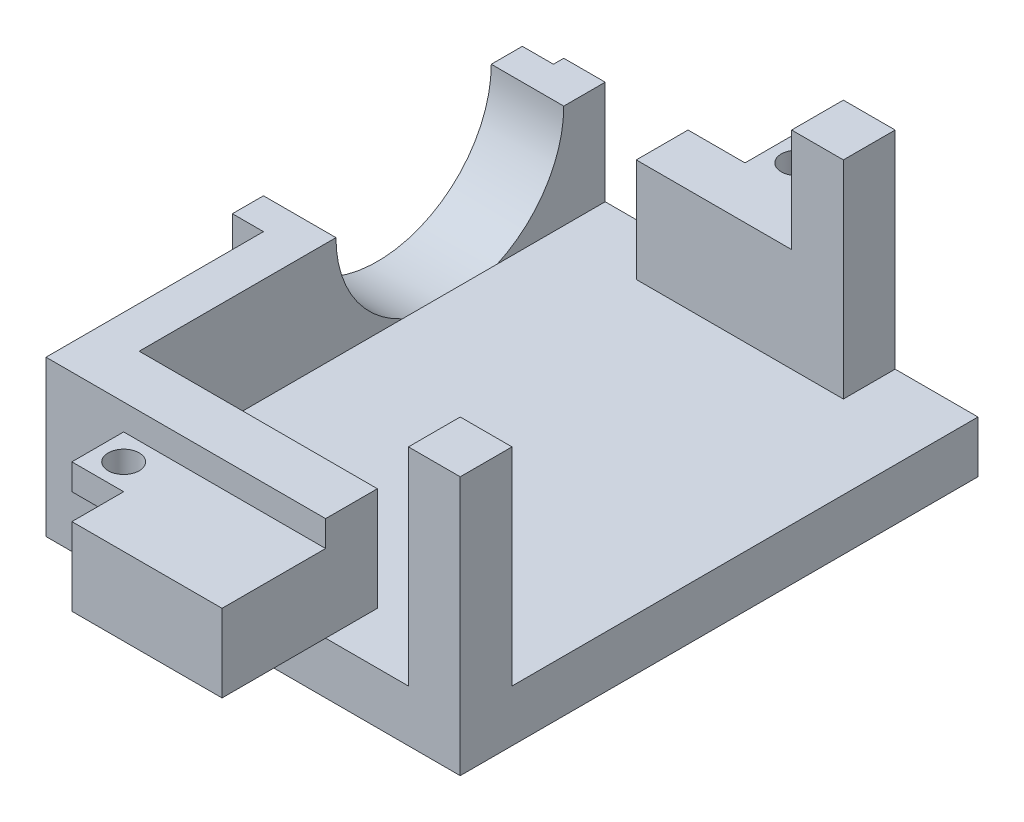
ISO-10303-21;
HEADER;
FILE_DESCRIPTION(('STEP AP214'),'2;1');
FILE_NAME('part.step','',(''),(''),'','','');
FILE_SCHEMA(('AUTOMOTIVE_DESIGN { 1 0 10303 214 1 1 1 1 }'));
ENDSEC;
DATA;
#1=APPLICATION_CONTEXT('core data for automotive mechanical design processes');
#2=APPLICATION_PROTOCOL_DEFINITION('international standard','automotive_design',2000,#1);
#3=PRODUCT_CONTEXT('',#1,'mechanical');
#4=PRODUCT('Part','Part','',(#3));
#5=PRODUCT_RELATED_PRODUCT_CATEGORY('part','',(#4));
#6=PRODUCT_DEFINITION_FORMATION('','',#4);
#7=PRODUCT_DEFINITION_CONTEXT('part definition',#1,'design');
#8=PRODUCT_DEFINITION('design','',#6,#7);
#9=PRODUCT_DEFINITION_SHAPE('','',#8);
#10=(LENGTH_UNIT() NAMED_UNIT(*) SI_UNIT(.MILLI.,.METRE.));
#11=(NAMED_UNIT(*) PLANE_ANGLE_UNIT() SI_UNIT($,.RADIAN.));
#12=(NAMED_UNIT(*) SI_UNIT($,.STERADIAN.) SOLID_ANGLE_UNIT());
#13=UNCERTAINTY_MEASURE_WITH_UNIT(LENGTH_MEASURE(1.E-05),#10,'distance_accuracy_value','');
#14=(GEOMETRIC_REPRESENTATION_CONTEXT(3) GLOBAL_UNCERTAINTY_ASSIGNED_CONTEXT((#13)) GLOBAL_UNIT_ASSIGNED_CONTEXT((#10,
#11,#12)) REPRESENTATION_CONTEXT('',''));
#15=CARTESIAN_POINT('',(0.,0.,0.));
#16=DIRECTION('',(0.,0.,1.));
#17=DIRECTION('',(1.,0.,0.));
#18=AXIS2_PLACEMENT_3D('',#15,#16,#17);
#19=CARTESIAN_POINT('',(-20.,5.,-25.));
#20=DIRECTION('',(0.,0.,1.));
#21=DIRECTION('',(1.,0.,0.));
#22=AXIS2_PLACEMENT_3D('',#19,#20,#21);
#23=PLANE('',#22);
#24=DIRECTION('',(0.,-1.,0.));
#25=VECTOR('',#24,1.);
#26=CARTESIAN_POINT('',(2.5,15.,-25.));
#27=LINE('',#26,#25);
#28=CARTESIAN_POINT('',(2.5,15.,-25.));
#29=VERTEX_POINT('',#28);
#30=CARTESIAN_POINT('',(2.5,10.,-25.));
#31=VERTEX_POINT('',#30);
#32=EDGE_CURVE('E359',#29,#31,#27,.T.);
#33=ORIENTED_EDGE('',*,*,#32,.F.);
#34=DIRECTION('',(-1.,0.,0.));
#35=VECTOR('',#34,1.);
#36=CARTESIAN_POINT('',(0.,15.,-25.));
#37=LINE('',#36,#35);
#38=CARTESIAN_POINT('',(7.,15.,-25.));
#39=VERTEX_POINT('',#38);
#40=EDGE_CURVE('E478',#39,#29,#37,.T.);
#41=ORIENTED_EDGE('',*,*,#40,.F.);
#42=DIRECTION('',(0.,-1.,0.));
#43=VECTOR('',#42,1.);
#44=CARTESIAN_POINT('',(7.,25.,-25.));
#45=LINE('',#44,#43);
#46=CARTESIAN_POINT('',(7.,25.,-25.));
#47=VERTEX_POINT('',#46);
#48=EDGE_CURVE('E510',#47,#39,#45,.T.);
#49=ORIENTED_EDGE('',*,*,#48,.F.);
#50=DIRECTION('',(-1.,0.,0.));
#51=VECTOR('',#50,1.);
#52=CARTESIAN_POINT('',(0.,25.,-25.));
#53=LINE('',#52,#51);
#54=CARTESIAN_POINT('',(12.,25.,-25.));
#55=VERTEX_POINT('',#54);
#56=EDGE_CURVE('E499',#55,#47,#53,.T.);
#57=ORIENTED_EDGE('',*,*,#56,.F.);
#58=DIRECTION('',(0.,-1.,0.));
#59=VECTOR('',#58,1.);
#60=CARTESIAN_POINT('',(12.,25.,-25.));
#61=LINE('',#60,#59);
#62=CARTESIAN_POINT('',(12.,5.,-25.));
#63=VERTEX_POINT('',#62);
#64=EDGE_CURVE('E513',#55,#63,#61,.T.);
#65=ORIENTED_EDGE('',*,*,#64,.T.);
#66=DIRECTION('',(-1.,0.,0.));
#67=VECTOR('',#66,1.);
#68=CARTESIAN_POINT('',(-20.,5.,-25.));
#69=LINE('',#68,#67);
#70=CARTESIAN_POINT('',(20.,5.,-25.));
#71=VERTEX_POINT('',#70);
#72=EDGE_CURVE('E550',#71,#63,#69,.T.);
#73=ORIENTED_EDGE('',*,*,#72,.F.);
#74=DIRECTION('',(0.,-1.,0.));
#75=VECTOR('',#74,1.);
#76=CARTESIAN_POINT('',(20.,5.,-25.));
#77=LINE('',#76,#75);
#78=CARTESIAN_POINT('',(20.,0.,-25.));
#79=VERTEX_POINT('',#78);
#80=EDGE_CURVE('E562',#71,#79,#77,.T.);
#81=ORIENTED_EDGE('',*,*,#80,.T.);
#82=DIRECTION('',(-1.,0.,0.));
#83=VECTOR('',#82,1.);
#84=CARTESIAN_POINT('',(-20.,0.,-25.));
#85=LINE('',#84,#83);
#86=CARTESIAN_POINT('',(-20.,0.,-25.));
#87=VERTEX_POINT('',#86);
#88=EDGE_CURVE('E547',#79,#87,#85,.T.);
#89=ORIENTED_EDGE('',*,*,#88,.T.);
#90=DIRECTION('',(0.,-1.,0.));
#91=VECTOR('',#90,1.);
#92=CARTESIAN_POINT('',(-20.,5.,-25.));
#93=LINE('',#92,#91);
#94=CARTESIAN_POINT('',(-20.,15.,-25.));
#95=VERTEX_POINT('',#94);
#96=EDGE_CURVE('E552',#95,#87,#93,.T.);
#97=ORIENTED_EDGE('',*,*,#96,.F.);
#98=DIRECTION('',(-1.,0.,0.));
#99=VECTOR('',#98,1.);
#100=CARTESIAN_POINT('',(0.,15.,-25.));
#101=LINE('',#100,#99);
#102=CARTESIAN_POINT('',(-16.,15.,-25.));
#103=VERTEX_POINT('',#102);
#104=EDGE_CURVE('E444',#103,#95,#101,.T.);
#105=ORIENTED_EDGE('',*,*,#104,.F.);
#106=DIRECTION('',(0.,-1.,0.));
#107=VECTOR('',#106,1.);
#108=CARTESIAN_POINT('',(-16.,15.,-25.));
#109=LINE('',#108,#107);
#110=CARTESIAN_POINT('',(-16.,5.,-25.));
#111=VERTEX_POINT('',#110);
#112=EDGE_CURVE('E464',#103,#111,#109,.T.);
#113=ORIENTED_EDGE('',*,*,#112,.T.);
#114=CARTESIAN_POINT('',(-8.,5.,-25.));
#115=VERTEX_POINT('',#114);
#116=EDGE_CURVE('E549',#115,#111,#69,.T.);
#117=ORIENTED_EDGE('',*,*,#116,.F.);
#118=DIRECTION('',(0.,-1.,0.));
#119=VECTOR('',#118,1.);
#120=CARTESIAN_POINT('',(-8.,15.,-25.));
#121=LINE('',#120,#119);
#122=CARTESIAN_POINT('',(-8.,15.,-25.));
#123=VERTEX_POINT('',#122);
#124=EDGE_CURVE('E490',#123,#115,#121,.T.);
#125=ORIENTED_EDGE('',*,*,#124,.F.);
#126=CARTESIAN_POINT('',(-2.5,15.,-25.));
#127=VERTEX_POINT('',#126);
#128=EDGE_CURVE('E477',#127,#123,#37,.T.);
#129=ORIENTED_EDGE('',*,*,#128,.F.);
#130=DIRECTION('',(0.,1.,0.));
#131=VECTOR('',#130,1.);
#132=CARTESIAN_POINT('',(-2.5,15.,-25.));
#133=LINE('',#132,#131);
#134=CARTESIAN_POINT('',(-2.5,10.,-25.));
#135=VERTEX_POINT('',#134);
#136=EDGE_CURVE('E366',#135,#127,#133,.T.);
#137=ORIENTED_EDGE('',*,*,#136,.F.);
#138=DIRECTION('',(-1.,0.,0.));
#139=VECTOR('',#138,1.);
#140=CARTESIAN_POINT('',(2.5,10.,-25.));
#141=LINE('',#140,#139);
#142=EDGE_CURVE('E92',#31,#135,#141,.T.);
#143=ORIENTED_EDGE('',*,*,#142,.F.);
#144=EDGE_LOOP('',(#33,#41,#49,#57,#65,#73,#81,#89,#97,#105,#113,#117,#125,#129,#137,#143));
#145=FACE_BOUND('',#144,.T.);
#146=ADVANCED_FACE('F69',(#145),#23,.F.);
#147=CARTESIAN_POINT('',(-20.,5.,-25.));
#148=DIRECTION('',(1.,0.,0.));
#149=DIRECTION('',(0.,0.,-1.));
#150=AXIS2_PLACEMENT_3D('',#147,#148,#149);
#151=PLANE('',#150);
#152=DIRECTION('',(0.,1.,0.));
#153=VECTOR('',#152,1.);
#154=CARTESIAN_POINT('',(-20.,15.,4.00000000000001));
#155=LINE('',#154,#153);
#156=CARTESIAN_POINT('',(-20.,0.,4.00000000000001));
#157=VERTEX_POINT('',#156);
#158=CARTESIAN_POINT('',(-20.,15.,4.00000000000001));
#159=VERTEX_POINT('',#158);
#160=EDGE_CURVE('E393',#157,#159,#155,.T.);
#161=ORIENTED_EDGE('',*,*,#160,.F.);
#162=DIRECTION('',(0.,0.,1.));
#163=VECTOR('',#162,1.);
#164=CARTESIAN_POINT('',(-20.,0.,-25.));
#165=LINE('',#164,#163);
#166=CARTESIAN_POINT('',(-20.,0.,25.));
#167=VERTEX_POINT('',#166);
#168=EDGE_CURVE('E543',#157,#167,#165,.T.);
#169=ORIENTED_EDGE('',*,*,#168,.T.);
#170=DIRECTION('',(0.,-1.,0.));
#171=VECTOR('',#170,1.);
#172=CARTESIAN_POINT('',(-20.,5.,25.));
#173=LINE('',#172,#171);
#174=CARTESIAN_POINT('',(-20.,15.,25.));
#175=VERTEX_POINT('',#174);
#176=EDGE_CURVE('E12',#175,#167,#173,.T.);
#177=ORIENTED_EDGE('',*,*,#176,.F.);
#178=DIRECTION('',(0.,0.,1.));
#179=VECTOR('',#178,1.);
#180=CARTESIAN_POINT('',(-20.,15.,0.));
#181=LINE('',#180,#179);
#182=EDGE_CURVE('E447',#159,#175,#181,.T.);
#183=ORIENTED_EDGE('',*,*,#182,.F.);
#184=EDGE_LOOP('',(#161,#169,#177,#183));
#185=FACE_BOUND('',#184,.T.);
#186=ADVANCED_FACE('F71',(#185),#151,.F.);
#187=DIRECTION('',(0.,-1.,0.));
#188=VECTOR('',#187,1.);
#189=CARTESIAN_POINT('',(-20.,0.,-24.));
#190=LINE('',#189,#188);
#191=CARTESIAN_POINT('',(-20.,15.,-24.));
#192=VERTEX_POINT('',#191);
#193=CARTESIAN_POINT('',(-20.,0.,-24.));
#194=VERTEX_POINT('',#193);
#195=EDGE_CURVE('E388',#192,#194,#190,.T.);
#196=ORIENTED_EDGE('',*,*,#195,.F.);
#197=EDGE_CURVE('E448',#95,#192,#181,.T.);
#198=ORIENTED_EDGE('',*,*,#197,.F.);
#199=ORIENTED_EDGE('',*,*,#96,.T.);
#200=EDGE_CURVE('E553',#87,#194,#165,.T.);
#201=ORIENTED_EDGE('',*,*,#200,.T.);
#202=EDGE_LOOP('',(#196,#198,#199,#201));
#203=FACE_BOUND('',#202,.T.);
#204=ADVANCED_FACE('F583',(#203),#151,.F.);
#205=CARTESIAN_POINT('',(-16.,15.,0.));
#206=DIRECTION('',(1.,0.,0.));
#207=DIRECTION('',(0.,0.,-1.));
#208=AXIS2_PLACEMENT_3D('',#205,#206,#207);
#209=PLANE('',#208);
#210=CARTESIAN_POINT('',(-16.,15.,-9.99999999999999));
#211=DIRECTION('',(-1.,0.,0.));
#212=DIRECTION('',(0.,0.,1.));
#213=AXIS2_PLACEMENT_3D('',#210,#211,#212);
#214=CIRCLE('',#213,11.);
#215=CARTESIAN_POINT('',(-16.,5.,-5.41742430504415));
#216=VERTEX_POINT('',#215);
#217=CARTESIAN_POINT('',(-16.,15.,1.00000000000001));
#218=VERTEX_POINT('',#217);
#219=EDGE_CURVE('E420',#216,#218,#214,.T.);
#220=ORIENTED_EDGE('',*,*,#219,.T.);
#221=DIRECTION('',(0.,0.,1.));
#222=VECTOR('',#221,1.);
#223=CARTESIAN_POINT('',(-16.,15.,0.));
#224=LINE('',#223,#222);
#225=CARTESIAN_POINT('',(-16.,15.,20.));
#226=VERTEX_POINT('',#225);
#227=EDGE_CURVE('E440',#218,#226,#224,.T.);
#228=ORIENTED_EDGE('',*,*,#227,.T.);
#229=DIRECTION('',(0.,-1.,0.));
#230=VECTOR('',#229,1.);
#231=CARTESIAN_POINT('',(-16.,15.,20.));
#232=LINE('',#231,#230);
#233=CARTESIAN_POINT('',(-16.,5.,20.));
#234=VERTEX_POINT('',#233);
#235=EDGE_CURVE('E467',#226,#234,#232,.T.);
#236=ORIENTED_EDGE('',*,*,#235,.T.);
#237=DIRECTION('',(0.,0.,1.));
#238=VECTOR('',#237,1.);
#239=CARTESIAN_POINT('',(-16.,5.,0.));
#240=LINE('',#239,#238);
#241=EDGE_CURVE('E459',#216,#234,#240,.T.);
#242=ORIENTED_EDGE('',*,*,#241,.F.);
#243=EDGE_LOOP('',(#220,#228,#236,#242));
#244=FACE_BOUND('',#243,.T.);
#245=ADVANCED_FACE('F899',(#244),#209,.T.);
#246=CARTESIAN_POINT('',(0.,15.,0.));
#247=DIRECTION('',(0.,1.,0.));
#248=DIRECTION('',(0.,0.,1.));
#249=AXIS2_PLACEMENT_3D('',#246,#247,#248);
#250=PLANE('',#249);
#251=DIRECTION('',(-1.,0.,0.));
#252=VECTOR('',#251,1.);
#253=CARTESIAN_POINT('',(-16.,15.,-21.));
#254=LINE('',#253,#252);
#255=CARTESIAN_POINT('',(-16.,15.,-21.));
#256=VERTEX_POINT('',#255);
#257=CARTESIAN_POINT('',(-23.,15.,-21.));
#258=VERTEX_POINT('',#257);
#259=EDGE_CURVE('E426',#256,#258,#254,.T.);
#260=ORIENTED_EDGE('',*,*,#259,.F.);
#261=EDGE_CURVE('E441',#103,#256,#224,.T.);
#262=ORIENTED_EDGE('',*,*,#261,.F.);
#263=ORIENTED_EDGE('',*,*,#104,.T.);
#264=ORIENTED_EDGE('',*,*,#197,.T.);
#265=DIRECTION('',(1.,0.,0.));
#266=VECTOR('',#265,1.);
#267=CARTESIAN_POINT('',(-23.,15.,-24.));
#268=LINE('',#267,#266);
#269=CARTESIAN_POINT('',(-23.,15.,-24.));
#270=VERTEX_POINT('',#269);
#271=EDGE_CURVE('E417',#270,#192,#268,.T.);
#272=ORIENTED_EDGE('',*,*,#271,.F.);
#273=DIRECTION('',(0.,0.,-1.));
#274=VECTOR('',#273,1.);
#275=CARTESIAN_POINT('',(-23.,15.,-24.));
#276=LINE('',#275,#274);
#277=EDGE_CURVE('E392',#258,#270,#276,.T.);
#278=ORIENTED_EDGE('',*,*,#277,.F.);
#279=EDGE_LOOP('',(#260,#262,#263,#264,#272,#278));
#280=FACE_BOUND('',#279,.T.);
#281=ADVANCED_FACE('F587',(#280),#250,.T.);
#282=CARTESIAN_POINT('',(0.,5.,0.));
#283=DIRECTION('',(0.,1.,0.));
#284=DIRECTION('',(0.,0.,1.));
#285=AXIS2_PLACEMENT_3D('',#282,#283,#284);
#286=PLANE('',#285);
#287=DIRECTION('',(-1.,0.,0.));
#288=VECTOR('',#287,1.);
#289=CARTESIAN_POINT('',(0.,5.,20.));
#290=LINE('',#289,#288);
#291=CARTESIAN_POINT('',(7.,5.,20.));
#292=VERTEX_POINT('',#291);
#293=EDGE_CURVE('E456',#292,#234,#290,.T.);
#294=ORIENTED_EDGE('',*,*,#293,.F.);
#295=DIRECTION('',(0.,0.,-1.));
#296=VECTOR('',#295,1.);
#297=CARTESIAN_POINT('',(6.99999999999999,5.,0.));
#298=LINE('',#297,#296);
#299=CARTESIAN_POINT('',(7.00000000000001,5.,25.));
#300=VERTEX_POINT('',#299);
#301=EDGE_CURVE('E432',#300,#292,#298,.T.);
#302=ORIENTED_EDGE('',*,*,#301,.F.);
#303=DIRECTION('',(1.,0.,0.));
#304=VECTOR('',#303,1.);
#305=CARTESIAN_POINT('',(-20.,5.,25.));
#306=LINE('',#305,#304);
#307=CARTESIAN_POINT('',(15.,5.,25.));
#308=VERTEX_POINT('',#307);
#309=EDGE_CURVE('E544',#300,#308,#306,.T.);
#310=ORIENTED_EDGE('',*,*,#309,.T.);
#311=DIRECTION('',(0.,0.,-1.));
#312=VECTOR('',#311,1.);
#313=CARTESIAN_POINT('',(15.,5.,0.));
#314=LINE('',#313,#312);
#315=CARTESIAN_POINT('',(15.,5.,20.));
#316=VERTEX_POINT('',#315);
#317=EDGE_CURVE('E519',#308,#316,#314,.T.);
#318=ORIENTED_EDGE('',*,*,#317,.T.);
#319=DIRECTION('',(-1.,0.,0.));
#320=VECTOR('',#319,1.);
#321=CARTESIAN_POINT('',(0.,5.,20.));
#322=LINE('',#321,#320);
#323=CARTESIAN_POINT('',(20.,5.,20.));
#324=VERTEX_POINT('',#323);
#325=EDGE_CURVE('E524',#324,#316,#322,.T.);
#326=ORIENTED_EDGE('',*,*,#325,.F.);
#327=DIRECTION('',(0.,0.,-1.));
#328=VECTOR('',#327,1.);
#329=CARTESIAN_POINT('',(20.,5.,-25.));
#330=LINE('',#329,#328);
#331=EDGE_CURVE('E546',#324,#71,#330,.T.);
#332=ORIENTED_EDGE('',*,*,#331,.T.);
#333=ORIENTED_EDGE('',*,*,#72,.T.);
#334=DIRECTION('',(0.,0.,-1.));
#335=VECTOR('',#334,1.);
#336=CARTESIAN_POINT('',(12.,5.,0.));
#337=LINE('',#336,#335);
#338=CARTESIAN_POINT('',(12.,5.,-20.));
#339=VERTEX_POINT('',#338);
#340=EDGE_CURVE('E497',#339,#63,#337,.T.);
#341=ORIENTED_EDGE('',*,*,#340,.F.);
#342=DIRECTION('',(1.,0.,0.));
#343=VECTOR('',#342,1.);
#344=CARTESIAN_POINT('',(0.,5.,-20.));
#345=LINE('',#344,#343);
#346=CARTESIAN_POINT('',(-8.,5.,-20.));
#347=VERTEX_POINT('',#346);
#348=EDGE_CURVE('E492',#347,#339,#345,.T.);
#349=ORIENTED_EDGE('',*,*,#348,.F.);
#350=DIRECTION('',(0.,0.,1.));
#351=VECTOR('',#350,1.);
#352=CARTESIAN_POINT('',(-7.99999999999999,5.,0.));
#353=LINE('',#352,#351);
#354=EDGE_CURVE('E473',#115,#347,#353,.T.);
#355=ORIENTED_EDGE('',*,*,#354,.F.);
#356=ORIENTED_EDGE('',*,*,#116,.T.);
#357=CARTESIAN_POINT('',(-16.,5.,-14.5825756949558));
#358=VERTEX_POINT('',#357);
#359=EDGE_CURVE('E437',#111,#358,#240,.T.);
#360=ORIENTED_EDGE('',*,*,#359,.T.);
#361=DIRECTION('',(0.,0.,1.));
#362=VECTOR('',#361,1.);
#363=CARTESIAN_POINT('',(-16.,5.,0.));
#364=LINE('',#363,#362);
#365=EDGE_CURVE('E428',#358,#216,#364,.T.);
#366=ORIENTED_EDGE('',*,*,#365,.T.);
#367=ORIENTED_EDGE('',*,*,#241,.T.);
#368=EDGE_LOOP('',(#294,#302,#310,#318,#326,#332,#333,#341,#349,#355,#356,#360,#366,#367));
#369=FACE_BOUND('',#368,.T.);
#370=ADVANCED_FACE('F608',(#369),#286,.T.);
#371=CARTESIAN_POINT('',(-20.,5.,25.));
#372=DIRECTION('',(0.,0.,-1.));
#373=DIRECTION('',(-1.,0.,0.));
#374=AXIS2_PLACEMENT_3D('',#371,#372,#373);
#375=PLANE('',#374);
#376=DIRECTION('',(-1.,0.,0.));
#377=VECTOR('',#376,1.);
#378=CARTESIAN_POINT('',(0.,5.,25.));
#379=LINE('',#378,#377);
#380=CARTESIAN_POINT('',(-7.49999999999999,5.,25.));
#381=VERTEX_POINT('',#380);
#382=EDGE_CURVE('E313',#300,#381,#379,.T.);
#383=ORIENTED_EDGE('',*,*,#382,.T.);
#384=DIRECTION('',(0.,1.,0.));
#385=VECTOR('',#384,1.);
#386=CARTESIAN_POINT('',(-7.49999999999999,0.,25.));
#387=LINE('',#386,#385);
#388=CARTESIAN_POINT('',(-7.49999999999999,10.,25.));
#389=VERTEX_POINT('',#388);
#390=EDGE_CURVE('E299',#381,#389,#387,.T.);
#391=ORIENTED_EDGE('',*,*,#390,.T.);
#392=DIRECTION('',(-1.,0.,0.));
#393=VECTOR('',#392,1.);
#394=CARTESIAN_POINT('',(0.,10.,25.));
#395=LINE('',#394,#393);
#396=CARTESIAN_POINT('',(-12.5,10.,25.));
#397=VERTEX_POINT('',#396);
#398=EDGE_CURVE('E304',#389,#397,#395,.T.);
#399=ORIENTED_EDGE('',*,*,#398,.T.);
#400=DIRECTION('',(0.,1.,0.));
#401=VECTOR('',#400,1.);
#402=CARTESIAN_POINT('',(-12.5,0.,25.));
#403=LINE('',#402,#401);
#404=CARTESIAN_POINT('',(-12.5,12.5,25.));
#405=VERTEX_POINT('',#404);
#406=EDGE_CURVE('E335',#397,#405,#403,.T.);
#407=ORIENTED_EDGE('',*,*,#406,.T.);
#408=DIRECTION('',(1.,0.,0.));
#409=VECTOR('',#408,1.);
#410=CARTESIAN_POINT('',(0.,12.5,25.));
#411=LINE('',#410,#409);
#412=CARTESIAN_POINT('',(7.00000000000001,12.5,25.));
#413=VERTEX_POINT('',#412);
#414=EDGE_CURVE('E84',#405,#413,#411,.T.);
#415=ORIENTED_EDGE('',*,*,#414,.T.);
#416=DIRECTION('',(0.,-1.,0.));
#417=VECTOR('',#416,1.);
#418=CARTESIAN_POINT('',(7.00000000000001,15.,25.));
#419=LINE('',#418,#417);
#420=CARTESIAN_POINT('',(7.00000000000001,15.,25.));
#421=VERTEX_POINT('',#420);
#422=EDGE_CURVE('E453',#421,#413,#419,.T.);
#423=ORIENTED_EDGE('',*,*,#422,.F.);
#424=DIRECTION('',(1.,0.,0.));
#425=VECTOR('',#424,1.);
#426=CARTESIAN_POINT('',(0.,15.,25.));
#427=LINE('',#426,#425);
#428=EDGE_CURVE('E451',#175,#421,#427,.T.);
#429=ORIENTED_EDGE('',*,*,#428,.F.);
#430=ORIENTED_EDGE('',*,*,#176,.T.);
#431=DIRECTION('',(1.,0.,0.));
#432=VECTOR('',#431,1.);
#433=CARTESIAN_POINT('',(-20.,0.,25.));
#434=LINE('',#433,#432);
#435=CARTESIAN_POINT('',(20.,0.,25.));
#436=VERTEX_POINT('',#435);
#437=EDGE_CURVE('E555',#167,#436,#434,.T.);
#438=ORIENTED_EDGE('',*,*,#437,.T.);
#439=DIRECTION('',(0.,-1.,0.));
#440=VECTOR('',#439,1.);
#441=CARTESIAN_POINT('',(20.,5.,25.));
#442=LINE('',#441,#440);
#443=CARTESIAN_POINT('',(20.,25.,25.));
#444=VERTEX_POINT('',#443);
#445=EDGE_CURVE('E77',#444,#436,#442,.T.);
#446=ORIENTED_EDGE('',*,*,#445,.F.);
#447=DIRECTION('',(1.,0.,0.));
#448=VECTOR('',#447,1.);
#449=CARTESIAN_POINT('',(0.,25.,25.));
#450=LINE('',#449,#448);
#451=CARTESIAN_POINT('',(15.,25.,25.));
#452=VERTEX_POINT('',#451);
#453=EDGE_CURVE('E523',#452,#444,#450,.T.);
#454=ORIENTED_EDGE('',*,*,#453,.F.);
#455=DIRECTION('',(0.,-1.,0.));
#456=VECTOR('',#455,1.);
#457=CARTESIAN_POINT('',(15.,25.,25.));
#458=LINE('',#457,#456);
#459=EDGE_CURVE('E540',#452,#308,#458,.T.);
#460=ORIENTED_EDGE('',*,*,#459,.T.);
#461=ORIENTED_EDGE('',*,*,#309,.F.);
#462=EDGE_LOOP('',(#383,#391,#399,#407,#415,#423,#429,#430,#438,#446,#454,#460,#461));
#463=FACE_BOUND('',#462,.T.);
#464=ADVANCED_FACE('F661',(#463),#375,.F.);
#465=CARTESIAN_POINT('',(20.,5.,-25.));
#466=DIRECTION('',(-1.,0.,0.));
#467=DIRECTION('',(0.,0.,1.));
#468=AXIS2_PLACEMENT_3D('',#465,#466,#467);
#469=PLANE('',#468);
#470=DIRECTION('',(0.,0.,-1.));
#471=VECTOR('',#470,1.);
#472=CARTESIAN_POINT('',(20.,0.,-25.));
#473=LINE('',#472,#471);
#474=EDGE_CURVE('E557',#436,#79,#473,.T.);
#475=ORIENTED_EDGE('',*,*,#474,.T.);
#476=ORIENTED_EDGE('',*,*,#80,.F.);
#477=ORIENTED_EDGE('',*,*,#331,.F.);
#478=DIRECTION('',(0.,-1.,0.));
#479=VECTOR('',#478,1.);
#480=CARTESIAN_POINT('',(20.,25.,20.));
#481=LINE('',#480,#479);
#482=CARTESIAN_POINT('',(20.,25.,20.));
#483=VERTEX_POINT('',#482);
#484=EDGE_CURVE('E537',#483,#324,#481,.T.);
#485=ORIENTED_EDGE('',*,*,#484,.F.);
#486=DIRECTION('',(0.,0.,-1.));
#487=VECTOR('',#486,1.);
#488=CARTESIAN_POINT('',(20.,25.,0.));
#489=LINE('',#488,#487);
#490=EDGE_CURVE('E527',#444,#483,#489,.T.);
#491=ORIENTED_EDGE('',*,*,#490,.F.);
#492=ORIENTED_EDGE('',*,*,#445,.T.);
#493=EDGE_LOOP('',(#475,#476,#477,#485,#491,#492));
#494=FACE_BOUND('',#493,.T.);
#495=ADVANCED_FACE('F568',(#494),#469,.F.);
#496=CARTESIAN_POINT('',(0.,0.,0.));
#497=DIRECTION('',(0.,1.,0.));
#498=DIRECTION('',(0.,0.,1.));
#499=AXIS2_PLACEMENT_3D('',#496,#497,#498);
#500=PLANE('',#499);
#501=ORIENTED_EDGE('',*,*,#200,.F.);
#502=ORIENTED_EDGE('',*,*,#88,.F.);
#503=ORIENTED_EDGE('',*,*,#474,.F.);
#504=ORIENTED_EDGE('',*,*,#437,.F.);
#505=ORIENTED_EDGE('',*,*,#168,.F.);
#506=DIRECTION('',(1.,0.,0.));
#507=VECTOR('',#506,1.);
#508=CARTESIAN_POINT('',(-23.,0.,4.00000000000001));
#509=LINE('',#508,#507);
#510=CARTESIAN_POINT('',(-23.,0.,4.00000000000001));
#511=VERTEX_POINT('',#510);
#512=EDGE_CURVE('E411',#511,#157,#509,.T.);
#513=ORIENTED_EDGE('',*,*,#512,.F.);
#514=DIRECTION('',(0.,0.,1.));
#515=VECTOR('',#514,1.);
#516=CARTESIAN_POINT('',(-23.,0.,4.00000000000001));
#517=LINE('',#516,#515);
#518=CARTESIAN_POINT('',(-23.,0.,-24.));
#519=VERTEX_POINT('',#518);
#520=EDGE_CURVE('E397',#519,#511,#517,.T.);
#521=ORIENTED_EDGE('',*,*,#520,.F.);
#522=DIRECTION('',(1.,0.,0.));
#523=VECTOR('',#522,1.);
#524=CARTESIAN_POINT('',(-23.,0.,-24.));
#525=LINE('',#524,#523);
#526=EDGE_CURVE('E414',#519,#194,#525,.T.);
#527=ORIENTED_EDGE('',*,*,#526,.T.);
#528=EDGE_LOOP('',(#501,#502,#503,#504,#505,#513,#521,#527));
#529=FACE_BOUND('',#528,.T.);
#530=ADVANCED_FACE('F577',(#529),#500,.F.);
#531=CARTESIAN_POINT('',(15.,25.,0.));
#532=DIRECTION('',(-1.,0.,0.));
#533=DIRECTION('',(0.,0.,1.));
#534=AXIS2_PLACEMENT_3D('',#531,#532,#533);
#535=PLANE('',#534);
#536=ORIENTED_EDGE('',*,*,#317,.F.);
#537=ORIENTED_EDGE('',*,*,#459,.F.);
#538=DIRECTION('',(0.,0.,-1.));
#539=VECTOR('',#538,1.);
#540=CARTESIAN_POINT('',(15.,25.,0.));
#541=LINE('',#540,#539);
#542=CARTESIAN_POINT('',(15.,25.,20.));
#543=VERTEX_POINT('',#542);
#544=EDGE_CURVE('E520',#452,#543,#541,.T.);
#545=ORIENTED_EDGE('',*,*,#544,.T.);
#546=DIRECTION('',(0.,-1.,0.));
#547=VECTOR('',#546,1.);
#548=CARTESIAN_POINT('',(15.,25.,20.));
#549=LINE('',#548,#547);
#550=EDGE_CURVE('E531',#543,#316,#549,.T.);
#551=ORIENTED_EDGE('',*,*,#550,.T.);
#552=EDGE_LOOP('',(#536,#537,#545,#551));
#553=FACE_BOUND('',#552,.T.);
#554=ADVANCED_FACE('F1028',(#553),#535,.T.);
#555=CARTESIAN_POINT('',(0.,25.,20.));
#556=DIRECTION('',(0.,0.,1.));
#557=DIRECTION('',(1.,0.,0.));
#558=AXIS2_PLACEMENT_3D('',#555,#556,#557);
#559=PLANE('',#558);
#560=ORIENTED_EDGE('',*,*,#325,.T.);
#561=ORIENTED_EDGE('',*,*,#550,.F.);
#562=DIRECTION('',(-1.,0.,0.));
#563=VECTOR('',#562,1.);
#564=CARTESIAN_POINT('',(0.,25.,20.));
#565=LINE('',#564,#563);
#566=EDGE_CURVE('E529',#483,#543,#565,.T.);
#567=ORIENTED_EDGE('',*,*,#566,.F.);
#568=ORIENTED_EDGE('',*,*,#484,.T.);
#569=EDGE_LOOP('',(#560,#561,#567,#568));
#570=FACE_BOUND('',#569,.T.);
#571=ADVANCED_FACE('F1018',(#570),#559,.F.);
#572=CARTESIAN_POINT('',(0.,25.,0.));
#573=DIRECTION('',(0.,1.,0.));
#574=DIRECTION('',(0.,0.,1.));
#575=AXIS2_PLACEMENT_3D('',#572,#573,#574);
#576=PLANE('',#575);
#577=ORIENTED_EDGE('',*,*,#544,.F.);
#578=ORIENTED_EDGE('',*,*,#453,.T.);
#579=ORIENTED_EDGE('',*,*,#490,.T.);
#580=ORIENTED_EDGE('',*,*,#566,.T.);
#581=EDGE_LOOP('',(#577,#578,#579,#580));
#582=FACE_BOUND('',#581,.T.);
#583=ADVANCED_FACE('F1010',(#582),#576,.T.);
#584=CARTESIAN_POINT('',(0.,25.,-20.));
#585=DIRECTION('',(0.,0.,-1.));
#586=DIRECTION('',(-1.,0.,0.));
#587=AXIS2_PLACEMENT_3D('',#584,#585,#586);
#588=PLANE('',#587);
#589=ORIENTED_EDGE('',*,*,#348,.T.);
#590=DIRECTION('',(0.,-1.,0.));
#591=VECTOR('',#590,1.);
#592=CARTESIAN_POINT('',(12.,25.,-20.));
#593=LINE('',#592,#591);
#594=CARTESIAN_POINT('',(12.,25.,-20.));
#595=VERTEX_POINT('',#594);
#596=EDGE_CURVE('E516',#595,#339,#593,.T.);
#597=ORIENTED_EDGE('',*,*,#596,.F.);
#598=DIRECTION('',(1.,0.,0.));
#599=VECTOR('',#598,1.);
#600=CARTESIAN_POINT('',(0.,25.,-20.));
#601=LINE('',#600,#599);
#602=CARTESIAN_POINT('',(7.,25.,-20.));
#603=VERTEX_POINT('',#602);
#604=EDGE_CURVE('E493',#603,#595,#601,.T.);
#605=ORIENTED_EDGE('',*,*,#604,.F.);
#606=DIRECTION('',(0.,-1.,0.));
#607=VECTOR('',#606,1.);
#608=CARTESIAN_POINT('',(7.,25.,-20.));
#609=LINE('',#608,#607);
#610=CARTESIAN_POINT('',(7.,15.,-20.));
#611=VERTEX_POINT('',#610);
#612=EDGE_CURVE('E503',#603,#611,#609,.T.);
#613=ORIENTED_EDGE('',*,*,#612,.T.);
#614=DIRECTION('',(1.,0.,0.));
#615=VECTOR('',#614,1.);
#616=CARTESIAN_POINT('',(0.,15.,-20.));
#617=LINE('',#616,#615);
#618=CARTESIAN_POINT('',(-8.,15.,-20.));
#619=VERTEX_POINT('',#618);
#620=EDGE_CURVE('E483',#619,#611,#617,.T.);
#621=ORIENTED_EDGE('',*,*,#620,.F.);
#622=DIRECTION('',(0.,-1.,0.));
#623=VECTOR('',#622,1.);
#624=CARTESIAN_POINT('',(-8.,15.,-20.));
#625=LINE('',#624,#623);
#626=EDGE_CURVE('E485',#619,#347,#625,.T.);
#627=ORIENTED_EDGE('',*,*,#626,.T.);
#628=EDGE_LOOP('',(#589,#597,#605,#613,#621,#627));
#629=FACE_BOUND('',#628,.T.);
#630=ADVANCED_FACE('F614',(#629),#588,.F.);
#631=CARTESIAN_POINT('',(12.,25.,0.));
#632=DIRECTION('',(-1.,0.,0.));
#633=DIRECTION('',(0.,0.,1.));
#634=AXIS2_PLACEMENT_3D('',#631,#632,#633);
#635=PLANE('',#634);
#636=ORIENTED_EDGE('',*,*,#340,.T.);
#637=ORIENTED_EDGE('',*,*,#64,.F.);
#638=DIRECTION('',(0.,0.,-1.));
#639=VECTOR('',#638,1.);
#640=CARTESIAN_POINT('',(12.,25.,0.));
#641=LINE('',#640,#639);
#642=EDGE_CURVE('E496',#595,#55,#641,.T.);
#643=ORIENTED_EDGE('',*,*,#642,.F.);
#644=ORIENTED_EDGE('',*,*,#596,.T.);
#645=EDGE_LOOP('',(#636,#637,#643,#644));
#646=FACE_BOUND('',#645,.T.);
#647=ADVANCED_FACE('F993',(#646),#635,.F.);
#648=CARTESIAN_POINT('',(7.,25.,0.));
#649=DIRECTION('',(1.,0.,0.));
#650=DIRECTION('',(0.,0.,-1.));
#651=AXIS2_PLACEMENT_3D('',#648,#649,#650);
#652=PLANE('',#651);
#653=ORIENTED_EDGE('',*,*,#48,.T.);
#654=DIRECTION('',(0.,0.,1.));
#655=VECTOR('',#654,1.);
#656=CARTESIAN_POINT('',(7.,15.,0.));
#657=LINE('',#656,#655);
#658=EDGE_CURVE('E474',#39,#611,#657,.T.);
#659=ORIENTED_EDGE('',*,*,#658,.T.);
#660=ORIENTED_EDGE('',*,*,#612,.F.);
#661=DIRECTION('',(0.,0.,1.));
#662=VECTOR('',#661,1.);
#663=CARTESIAN_POINT('',(7.,25.,0.));
#664=LINE('',#663,#662);
#665=EDGE_CURVE('E501',#47,#603,#664,.T.);
#666=ORIENTED_EDGE('',*,*,#665,.F.);
#667=EDGE_LOOP('',(#653,#659,#660,#666));
#668=FACE_BOUND('',#667,.T.);
#669=ADVANCED_FACE('F622',(#668),#652,.F.);
#670=CARTESIAN_POINT('',(0.,25.,0.));
#671=DIRECTION('',(0.,1.,0.));
#672=DIRECTION('',(0.,0.,1.));
#673=AXIS2_PLACEMENT_3D('',#670,#671,#672);
#674=PLANE('',#673);
#675=ORIENTED_EDGE('',*,*,#604,.T.);
#676=ORIENTED_EDGE('',*,*,#642,.T.);
#677=ORIENTED_EDGE('',*,*,#56,.T.);
#678=ORIENTED_EDGE('',*,*,#665,.T.);
#679=EDGE_LOOP('',(#675,#676,#677,#678));
#680=FACE_BOUND('',#679,.T.);
#681=ADVANCED_FACE('F973',(#680),#674,.T.);
#682=CARTESIAN_POINT('',(-7.99999999999999,15.,0.));
#683=DIRECTION('',(1.,0.,0.));
#684=DIRECTION('',(0.,0.,-1.));
#685=AXIS2_PLACEMENT_3D('',#682,#683,#684);
#686=PLANE('',#685);
#687=ORIENTED_EDGE('',*,*,#354,.T.);
#688=ORIENTED_EDGE('',*,*,#626,.F.);
#689=DIRECTION('',(0.,0.,1.));
#690=VECTOR('',#689,1.);
#691=CARTESIAN_POINT('',(-7.99999999999999,15.,0.));
#692=LINE('',#691,#690);
#693=EDGE_CURVE('E481',#123,#619,#692,.T.);
#694=ORIENTED_EDGE('',*,*,#693,.F.);
#695=ORIENTED_EDGE('',*,*,#124,.T.);
#696=EDGE_LOOP('',(#687,#688,#694,#695));
#697=FACE_BOUND('',#696,.T.);
#698=ADVANCED_FACE('F611',(#697),#686,.F.);
#699=CARTESIAN_POINT('',(0.,15.,0.));
#700=DIRECTION('',(0.,1.,0.));
#701=DIRECTION('',(0.,0.,1.));
#702=AXIS2_PLACEMENT_3D('',#699,#700,#701);
#703=PLANE('',#702);
#704=CARTESIAN_POINT('',(0.,15.,-27.5));
#705=DIRECTION('',(0.,-1.,0.));
#706=DIRECTION('',(0.,0.,-1.));
#707=AXIS2_PLACEMENT_3D('',#704,#705,#706);
#708=CIRCLE('',#707,1.5);
#709=CARTESIAN_POINT('',(0.,15.,-29.));
#710=VERTEX_POINT('',#709);
#711=EDGE_CURVE('E356',#710,#710,#708,.T.);
#712=ORIENTED_EDGE('',*,*,#711,.T.);
#713=EDGE_LOOP('',(#712));
#714=FACE_BOUND('',#713,.T.);
#715=ORIENTED_EDGE('',*,*,#658,.F.);
#716=ORIENTED_EDGE('',*,*,#40,.T.);
#717=DIRECTION('',(0.,0.,1.));
#718=VECTOR('',#717,1.);
#719=CARTESIAN_POINT('',(2.5,15.,-30.));
#720=LINE('',#719,#718);
#721=CARTESIAN_POINT('',(2.5,15.,-30.));
#722=VERTEX_POINT('',#721);
#723=EDGE_CURVE('E372',#722,#29,#720,.T.);
#724=ORIENTED_EDGE('',*,*,#723,.F.);
#725=DIRECTION('',(1.,0.,0.));
#726=VECTOR('',#725,1.);
#727=CARTESIAN_POINT('',(2.5,15.,-30.));
#728=LINE('',#727,#726);
#729=CARTESIAN_POINT('',(-2.5,15.,-30.));
#730=VERTEX_POINT('',#729);
#731=EDGE_CURVE('E370',#730,#722,#728,.T.);
#732=ORIENTED_EDGE('',*,*,#731,.F.);
#733=DIRECTION('',(0.,0.,1.));
#734=VECTOR('',#733,1.);
#735=CARTESIAN_POINT('',(-2.5,15.,-30.));
#736=LINE('',#735,#734);
#737=EDGE_CURVE('E380',#730,#127,#736,.T.);
#738=ORIENTED_EDGE('',*,*,#737,.T.);
#739=ORIENTED_EDGE('',*,*,#128,.T.);
#740=ORIENTED_EDGE('',*,*,#693,.T.);
#741=ORIENTED_EDGE('',*,*,#620,.T.);
#742=EDGE_LOOP('',(#715,#716,#724,#732,#738,#739,#740,#741));
#743=FACE_BOUND('',#742,.T.);
#744=ADVANCED_FACE('F620',(#714,#743),#703,.T.);
#745=CARTESIAN_POINT('',(6.99999999999999,15.,0.));
#746=DIRECTION('',(-1.,0.,0.));
#747=DIRECTION('',(0.,0.,1.));
#748=AXIS2_PLACEMENT_3D('',#745,#746,#747);
#749=PLANE('',#748);
#750=ORIENTED_EDGE('',*,*,#301,.T.);
#751=DIRECTION('',(0.,-1.,0.));
#752=VECTOR('',#751,1.);
#753=CARTESIAN_POINT('',(7.,15.,20.));
#754=LINE('',#753,#752);
#755=CARTESIAN_POINT('',(7.,15.,20.));
#756=VERTEX_POINT('',#755);
#757=EDGE_CURVE('E470',#756,#292,#754,.T.);
#758=ORIENTED_EDGE('',*,*,#757,.F.);
#759=DIRECTION('',(0.,0.,-1.));
#760=VECTOR('',#759,1.);
#761=CARTESIAN_POINT('',(6.99999999999999,15.,0.));
#762=LINE('',#761,#760);
#763=EDGE_CURVE('E433',#421,#756,#762,.T.);
#764=ORIENTED_EDGE('',*,*,#763,.F.);
#765=ORIENTED_EDGE('',*,*,#422,.T.);
#766=DIRECTION('',(0.,0.,-1.));
#767=VECTOR('',#766,1.);
#768=CARTESIAN_POINT('',(7.00000000000001,12.5,35.));
#769=LINE('',#768,#767);
#770=CARTESIAN_POINT('',(7.00000000000001,12.5,35.));
#771=VERTEX_POINT('',#770);
#772=EDGE_CURVE('E328',#771,#413,#769,.T.);
#773=ORIENTED_EDGE('',*,*,#772,.F.);
#774=DIRECTION('',(0.,1.,0.));
#775=VECTOR('',#774,1.);
#776=CARTESIAN_POINT('',(7.00000000000001,0.,35.));
#777=LINE('',#776,#775);
#778=CARTESIAN_POINT('',(7.00000000000001,5.,35.));
#779=VERTEX_POINT('',#778);
#780=EDGE_CURVE('E317',#779,#771,#777,.T.);
#781=ORIENTED_EDGE('',*,*,#780,.F.);
#782=DIRECTION('',(0.,0.,-1.));
#783=VECTOR('',#782,1.);
#784=CARTESIAN_POINT('',(7.00000000000001,5.,35.));
#785=LINE('',#784,#783);
#786=EDGE_CURVE('E305',#779,#300,#785,.T.);
#787=ORIENTED_EDGE('',*,*,#786,.T.);
#788=EDGE_LOOP('',(#750,#758,#764,#765,#773,#781,#787));
#789=FACE_BOUND('',#788,.T.);
#790=ADVANCED_FACE('F671',(#789),#749,.F.);
#791=CARTESIAN_POINT('',(0.,15.,20.));
#792=DIRECTION('',(0.,0.,1.));
#793=DIRECTION('',(1.,0.,0.));
#794=AXIS2_PLACEMENT_3D('',#791,#792,#793);
#795=PLANE('',#794);
#796=ORIENTED_EDGE('',*,*,#293,.T.);
#797=ORIENTED_EDGE('',*,*,#235,.F.);
#798=DIRECTION('',(-1.,0.,0.));
#799=VECTOR('',#798,1.);
#800=CARTESIAN_POINT('',(0.,15.,20.));
#801=LINE('',#800,#799);
#802=EDGE_CURVE('E436',#756,#226,#801,.T.);
#803=ORIENTED_EDGE('',*,*,#802,.F.);
#804=ORIENTED_EDGE('',*,*,#757,.T.);
#805=EDGE_LOOP('',(#796,#797,#803,#804));
#806=FACE_BOUND('',#805,.T.);
#807=ADVANCED_FACE('F770',(#806),#795,.F.);
#808=EDGE_CURVE('E421',#256,#358,#214,.T.);
#809=ORIENTED_EDGE('',*,*,#808,.T.);
#810=ORIENTED_EDGE('',*,*,#359,.F.);
#811=ORIENTED_EDGE('',*,*,#112,.F.);
#812=ORIENTED_EDGE('',*,*,#261,.T.);
#813=EDGE_LOOP('',(#809,#810,#811,#812));
#814=FACE_BOUND('',#813,.T.);
#815=ADVANCED_FACE('F601',(#814),#209,.T.);
#816=DIRECTION('',(-1.,0.,0.));
#817=VECTOR('',#816,1.);
#818=CARTESIAN_POINT('',(-16.,15.,1.00000000000001));
#819=LINE('',#818,#817);
#820=CARTESIAN_POINT('',(-23.,15.,1.00000000000001));
#821=VERTEX_POINT('',#820);
#822=EDGE_CURVE('E424',#218,#821,#819,.T.);
#823=ORIENTED_EDGE('',*,*,#822,.T.);
#824=DIRECTION('',(0.,0.,-1.));
#825=VECTOR('',#824,1.);
#826=CARTESIAN_POINT('',(-23.,15.,1.00000000000001));
#827=LINE('',#826,#825);
#828=CARTESIAN_POINT('',(-23.,15.,4.00000000000001));
#829=VERTEX_POINT('',#828);
#830=EDGE_CURVE('E401',#829,#821,#827,.T.);
#831=ORIENTED_EDGE('',*,*,#830,.F.);
#832=DIRECTION('',(1.,0.,0.));
#833=VECTOR('',#832,1.);
#834=CARTESIAN_POINT('',(-23.,15.,4.00000000000001));
#835=LINE('',#834,#833);
#836=EDGE_CURVE('E404',#829,#159,#835,.T.);
#837=ORIENTED_EDGE('',*,*,#836,.T.);
#838=ORIENTED_EDGE('',*,*,#182,.T.);
#839=ORIENTED_EDGE('',*,*,#428,.T.);
#840=ORIENTED_EDGE('',*,*,#763,.T.);
#841=ORIENTED_EDGE('',*,*,#802,.T.);
#842=ORIENTED_EDGE('',*,*,#227,.F.);
#843=EDGE_LOOP('',(#823,#831,#837,#838,#839,#840,#841,#842));
#844=FACE_BOUND('',#843,.T.);
#845=ADVANCED_FACE('F920',(#844),#250,.T.);
#846=CARTESIAN_POINT('',(-16.,15.,-9.99999999999999));
#847=DIRECTION('',(-1.,0.,0.));
#848=DIRECTION('',(0.,0.,1.));
#849=AXIS2_PLACEMENT_3D('',#846,#847,#848);
#850=CYLINDRICAL_SURFACE('',#849,11.);
#851=ORIENTED_EDGE('',*,*,#259,.T.);
#852=CARTESIAN_POINT('',(-23.,15.,-9.99999999999997));
#853=DIRECTION('',(1.,0.,0.));
#854=DIRECTION('',(0.,0.,1.));
#855=AXIS2_PLACEMENT_3D('',#852,#853,#854);
#856=CIRCLE('',#855,11.);
#857=EDGE_CURVE('E389',#821,#258,#856,.T.);
#858=ORIENTED_EDGE('',*,*,#857,.F.);
#859=ORIENTED_EDGE('',*,*,#822,.F.);
#860=ORIENTED_EDGE('',*,*,#219,.F.);
#861=EDGE_CURVE('E425',#358,#216,#214,.T.);
#862=ORIENTED_EDGE('',*,*,#861,.F.);
#863=ORIENTED_EDGE('',*,*,#808,.F.);
#864=EDGE_LOOP('',(#851,#858,#859,#860,#862,#863));
#865=FACE_BOUND('',#864,.T.);
#866=ADVANCED_FACE('F910',(#865),#850,.F.);
#867=CARTESIAN_POINT('',(-16.,15.,-9.99999999999999));
#868=DIRECTION('',(-1.,0.,0.));
#869=DIRECTION('',(0.,0.,1.));
#870=AXIS2_PLACEMENT_3D('',#867,#868,#869);
#871=PLANE('',#870);
#872=ORIENTED_EDGE('',*,*,#861,.T.);
#873=ORIENTED_EDGE('',*,*,#365,.F.);
#874=EDGE_LOOP('',(#872,#873));
#875=FACE_BOUND('',#874,.T.);
#876=ADVANCED_FACE('F878',(#875),#871,.T.);
#877=CARTESIAN_POINT('',(-23.,0.,-24.));
#878=DIRECTION('',(0.,0.,1.));
#879=DIRECTION('',(0.,-1.,0.));
#880=AXIS2_PLACEMENT_3D('',#877,#878,#879);
#881=PLANE('',#880);
#882=ORIENTED_EDGE('',*,*,#195,.T.);
#883=ORIENTED_EDGE('',*,*,#526,.F.);
#884=DIRECTION('',(0.,-1.,0.));
#885=VECTOR('',#884,1.);
#886=CARTESIAN_POINT('',(-23.,0.,-24.));
#887=LINE('',#886,#885);
#888=EDGE_CURVE('E395',#270,#519,#887,.T.);
#889=ORIENTED_EDGE('',*,*,#888,.F.);
#890=ORIENTED_EDGE('',*,*,#271,.T.);
#891=EDGE_LOOP('',(#882,#883,#889,#890));
#892=FACE_BOUND('',#891,.T.);
#893=ADVANCED_FACE('F592',(#892),#881,.F.);
#894=CARTESIAN_POINT('',(-23.,15.,4.00000000000001));
#895=DIRECTION('',(0.,0.,-1.));
#896=DIRECTION('',(0.,1.,0.));
#897=AXIS2_PLACEMENT_3D('',#894,#895,#896);
#898=PLANE('',#897);
#899=ORIENTED_EDGE('',*,*,#160,.T.);
#900=ORIENTED_EDGE('',*,*,#836,.F.);
#901=DIRECTION('',(0.,1.,0.));
#902=VECTOR('',#901,1.);
#903=CARTESIAN_POINT('',(-23.,15.,4.00000000000001));
#904=LINE('',#903,#902);
#905=EDGE_CURVE('E399',#511,#829,#904,.T.);
#906=ORIENTED_EDGE('',*,*,#905,.F.);
#907=ORIENTED_EDGE('',*,*,#512,.T.);
#908=EDGE_LOOP('',(#899,#900,#906,#907));
#909=FACE_BOUND('',#908,.T.);
#910=ADVANCED_FACE('F860',(#909),#898,.F.);
#911=CARTESIAN_POINT('',(-23.,15.,-9.99999999999997));
#912=DIRECTION('',(-1.,0.,0.));
#913=DIRECTION('',(0.,0.,1.));
#914=AXIS2_PLACEMENT_3D('',#911,#912,#913);
#915=PLANE('',#914);
#916=ORIENTED_EDGE('',*,*,#857,.T.);
#917=ORIENTED_EDGE('',*,*,#277,.T.);
#918=ORIENTED_EDGE('',*,*,#888,.T.);
#919=ORIENTED_EDGE('',*,*,#520,.T.);
#920=ORIENTED_EDGE('',*,*,#905,.T.);
#921=ORIENTED_EDGE('',*,*,#830,.T.);
#922=EDGE_LOOP('',(#916,#917,#918,#919,#920,#921));
#923=FACE_BOUND('',#922,.T.);
#924=ADVANCED_FACE('F596',(#923),#915,.T.);
#925=CARTESIAN_POINT('',(2.5,15.,-30.));
#926=DIRECTION('',(-1.,0.,0.));
#927=DIRECTION('',(0.,-1.,0.));
#928=AXIS2_PLACEMENT_3D('',#925,#926,#927);
#929=PLANE('',#928);
#930=ORIENTED_EDGE('',*,*,#32,.T.);
#931=DIRECTION('',(0.,0.,1.));
#932=VECTOR('',#931,1.);
#933=CARTESIAN_POINT('',(2.5,10.,-30.));
#934=LINE('',#933,#932);
#935=CARTESIAN_POINT('',(2.5,10.,-30.));
#936=VERTEX_POINT('',#935);
#937=EDGE_CURVE('E386',#936,#31,#934,.T.);
#938=ORIENTED_EDGE('',*,*,#937,.F.);
#939=DIRECTION('',(0.,-1.,0.));
#940=VECTOR('',#939,1.);
#941=CARTESIAN_POINT('',(2.5,15.,-30.));
#942=LINE('',#941,#940);
#943=EDGE_CURVE('E362',#722,#936,#942,.T.);
#944=ORIENTED_EDGE('',*,*,#943,.F.);
#945=ORIENTED_EDGE('',*,*,#723,.T.);
#946=EDGE_LOOP('',(#930,#938,#944,#945));
#947=FACE_BOUND('',#946,.T.);
#948=ADVANCED_FACE('F630',(#947),#929,.F.);
#949=CARTESIAN_POINT('',(2.5,10.,-30.));
#950=DIRECTION('',(0.,1.,0.));
#951=DIRECTION('',(0.,0.,1.));
#952=AXIS2_PLACEMENT_3D('',#949,#950,#951);
#953=PLANE('',#952);
#954=CARTESIAN_POINT('',(0.,10.,-27.5));
#955=DIRECTION('',(0.,-1.,0.));
#956=DIRECTION('',(0.,0.,-1.));
#957=AXIS2_PLACEMENT_3D('',#954,#955,#956);
#958=CIRCLE('',#957,1.5);
#959=CARTESIAN_POINT('',(0.,10.,-29.));
#960=VERTEX_POINT('',#959);
#961=EDGE_CURVE('E355',#960,#960,#958,.T.);
#962=ORIENTED_EDGE('',*,*,#961,.F.);
#963=EDGE_LOOP('',(#962));
#964=FACE_BOUND('',#963,.T.);
#965=ORIENTED_EDGE('',*,*,#142,.T.);
#966=DIRECTION('',(0.,0.,1.));
#967=VECTOR('',#966,1.);
#968=CARTESIAN_POINT('',(-2.5,10.,-30.));
#969=LINE('',#968,#967);
#970=CARTESIAN_POINT('',(-2.5,10.,-30.));
#971=VERTEX_POINT('',#970);
#972=EDGE_CURVE('E383',#971,#135,#969,.T.);
#973=ORIENTED_EDGE('',*,*,#972,.F.);
#974=DIRECTION('',(-1.,0.,0.));
#975=VECTOR('',#974,1.);
#976=CARTESIAN_POINT('',(2.5,10.,-30.));
#977=LINE('',#976,#975);
#978=EDGE_CURVE('E365',#936,#971,#977,.T.);
#979=ORIENTED_EDGE('',*,*,#978,.F.);
#980=ORIENTED_EDGE('',*,*,#937,.T.);
#981=EDGE_LOOP('',(#965,#973,#979,#980));
#982=FACE_BOUND('',#981,.T.);
#983=ADVANCED_FACE('F640',(#964,#982),#953,.F.);
#984=CARTESIAN_POINT('',(-2.5,15.,-30.));
#985=DIRECTION('',(1.,0.,0.));
#986=DIRECTION('',(0.,1.,0.));
#987=AXIS2_PLACEMENT_3D('',#984,#985,#986);
#988=PLANE('',#987);
#989=ORIENTED_EDGE('',*,*,#136,.T.);
#990=ORIENTED_EDGE('',*,*,#737,.F.);
#991=DIRECTION('',(0.,1.,0.));
#992=VECTOR('',#991,1.);
#993=CARTESIAN_POINT('',(-2.5,15.,-30.));
#994=LINE('',#993,#992);
#995=EDGE_CURVE('E368',#971,#730,#994,.T.);
#996=ORIENTED_EDGE('',*,*,#995,.F.);
#997=ORIENTED_EDGE('',*,*,#972,.T.);
#998=EDGE_LOOP('',(#989,#990,#996,#997));
#999=FACE_BOUND('',#998,.T.);
#1000=ADVANCED_FACE('F638',(#999),#988,.F.);
#1001=CARTESIAN_POINT('',(0.,0.,-30.));
#1002=DIRECTION('',(0.,0.,-1.));
#1003=DIRECTION('',(-1.,0.,0.));
#1004=AXIS2_PLACEMENT_3D('',#1001,#1002,#1003);
#1005=PLANE('',#1004);
#1006=ORIENTED_EDGE('',*,*,#943,.T.);
#1007=ORIENTED_EDGE('',*,*,#978,.T.);
#1008=ORIENTED_EDGE('',*,*,#995,.T.);
#1009=ORIENTED_EDGE('',*,*,#731,.T.);
#1010=EDGE_LOOP('',(#1006,#1007,#1008,#1009));
#1011=FACE_BOUND('',#1010,.T.);
#1012=ADVANCED_FACE('F633',(#1011),#1005,.T.);
#1013=CARTESIAN_POINT('',(0.,15.,-27.5));
#1014=DIRECTION('',(0.,-1.,0.));
#1015=DIRECTION('',(0.,0.,-1.));
#1016=AXIS2_PLACEMENT_3D('',#1013,#1014,#1015);
#1017=CYLINDRICAL_SURFACE('',#1016,1.5);
#1018=ORIENTED_EDGE('',*,*,#711,.F.);
#1019=EDGE_LOOP('',(#1018));
#1020=FACE_BOUND('',#1019,.T.);
#1021=ORIENTED_EDGE('',*,*,#961,.T.);
#1022=EDGE_LOOP('',(#1021));
#1023=FACE_BOUND('',#1022,.T.);
#1024=ADVANCED_FACE('F700',(#1020,#1023),#1017,.F.);
#1025=CARTESIAN_POINT('',(0.,10.,30.));
#1026=DIRECTION('',(0.,-1.,0.));
#1027=DIRECTION('',(1.,0.,0.));
#1028=AXIS2_PLACEMENT_3D('',#1025,#1026,#1027);
#1029=PLANE('',#1028);
#1030=CARTESIAN_POINT('',(-9.99999999999999,10.,27.4999999999997));
#1031=DIRECTION('',(0.,-1.,0.));
#1032=DIRECTION('',(1.,0.,0.));
#1033=AXIS2_PLACEMENT_3D('',#1030,#1031,#1032);
#1034=CIRCLE('',#1033,1.5);
#1035=CARTESIAN_POINT('',(-8.49999999999999,10.,27.4999999999997));
#1036=VERTEX_POINT('',#1035);
#1037=EDGE_CURVE('E1197',#1036,#1036,#1034,.T.);
#1038=ORIENTED_EDGE('',*,*,#1037,.F.);
#1039=EDGE_LOOP('',(#1038));
#1040=FACE_BOUND('',#1039,.T.);
#1041=ORIENTED_EDGE('',*,*,#398,.F.);
#1042=DIRECTION('',(0.,0.,-1.));
#1043=VECTOR('',#1042,1.);
#1044=CARTESIAN_POINT('',(-7.49999999999999,10.,30.));
#1045=LINE('',#1044,#1043);
#1046=CARTESIAN_POINT('',(-7.49999999999999,10.,30.));
#1047=VERTEX_POINT('',#1046);
#1048=EDGE_CURVE('E353',#1047,#389,#1045,.T.);
#1049=ORIENTED_EDGE('',*,*,#1048,.F.);
#1050=DIRECTION('',(-1.,0.,0.));
#1051=VECTOR('',#1050,1.);
#1052=CARTESIAN_POINT('',(0.,10.,30.));
#1053=LINE('',#1052,#1051);
#1054=CARTESIAN_POINT('',(-12.5,10.,30.));
#1055=VERTEX_POINT('',#1054);
#1056=EDGE_CURVE('E331',#1047,#1055,#1053,.T.);
#1057=ORIENTED_EDGE('',*,*,#1056,.T.);
#1058=DIRECTION('',(0.,0.,-1.));
#1059=VECTOR('',#1058,1.);
#1060=CARTESIAN_POINT('',(-12.5,10.,30.));
#1061=LINE('',#1060,#1059);
#1062=EDGE_CURVE('E344',#1055,#397,#1061,.T.);
#1063=ORIENTED_EDGE('',*,*,#1062,.T.);
#1064=EDGE_LOOP('',(#1041,#1049,#1057,#1063));
#1065=FACE_BOUND('',#1064,.T.);
#1066=ADVANCED_FACE('F683',(#1040,#1065),#1029,.T.);
#1067=CARTESIAN_POINT('',(0.,12.5,30.));
#1068=DIRECTION('',(0.,1.,0.));
#1069=DIRECTION('',(0.,0.,1.));
#1070=AXIS2_PLACEMENT_3D('',#1067,#1068,#1069);
#1071=PLANE('',#1070);
#1072=CARTESIAN_POINT('',(-9.99999999999999,12.5,27.4999999999997));
#1073=DIRECTION('',(0.,-1.,0.));
#1074=DIRECTION('',(1.,0.,0.));
#1075=AXIS2_PLACEMENT_3D('',#1072,#1073,#1074);
#1076=CIRCLE('',#1075,1.5);
#1077=CARTESIAN_POINT('',(-8.49999999999999,12.5,27.4999999999997));
#1078=VERTEX_POINT('',#1077);
#1079=EDGE_CURVE('E325',#1078,#1078,#1076,.T.);
#1080=ORIENTED_EDGE('',*,*,#1079,.T.);
#1081=EDGE_LOOP('',(#1080));
#1082=FACE_BOUND('',#1081,.T.);
#1083=ORIENTED_EDGE('',*,*,#414,.F.);
#1084=DIRECTION('',(0.,0.,-1.));
#1085=VECTOR('',#1084,1.);
#1086=CARTESIAN_POINT('',(-12.5,12.5,30.));
#1087=LINE('',#1086,#1085);
#1088=CARTESIAN_POINT('',(-12.5,12.5,30.));
#1089=VERTEX_POINT('',#1088);
#1090=EDGE_CURVE('E351',#1089,#405,#1087,.T.);
#1091=ORIENTED_EDGE('',*,*,#1090,.F.);
#1092=DIRECTION('',(1.,0.,0.));
#1093=VECTOR('',#1092,1.);
#1094=CARTESIAN_POINT('',(0.,12.5,30.));
#1095=LINE('',#1094,#1093);
#1096=CARTESIAN_POINT('',(-7.49999999999999,12.5,30.));
#1097=VERTEX_POINT('',#1096);
#1098=EDGE_CURVE('E338',#1089,#1097,#1095,.T.);
#1099=ORIENTED_EDGE('',*,*,#1098,.T.);
#1100=DIRECTION('',(0.,0.,-1.));
#1101=VECTOR('',#1100,1.);
#1102=CARTESIAN_POINT('',(-7.49999999999999,12.5,35.));
#1103=LINE('',#1102,#1101);
#1104=CARTESIAN_POINT('',(-7.49999999999999,12.5,35.));
#1105=VERTEX_POINT('',#1104);
#1106=EDGE_CURVE('E323',#1105,#1097,#1103,.T.);
#1107=ORIENTED_EDGE('',*,*,#1106,.F.);
#1108=DIRECTION('',(1.,0.,0.));
#1109=VECTOR('',#1108,1.);
#1110=CARTESIAN_POINT('',(0.,12.5,35.));
#1111=LINE('',#1110,#1109);
#1112=EDGE_CURVE('E312',#1105,#771,#1111,.T.);
#1113=ORIENTED_EDGE('',*,*,#1112,.T.);
#1114=ORIENTED_EDGE('',*,*,#772,.T.);
#1115=EDGE_LOOP('',(#1083,#1091,#1099,#1107,#1113,#1114));
#1116=FACE_BOUND('',#1115,.T.);
#1117=ADVANCED_FACE('F675',(#1082,#1116),#1071,.T.);
#1118=CARTESIAN_POINT('',(-12.5,0.,30.));
#1119=DIRECTION('',(-1.,0.,0.));
#1120=DIRECTION('',(0.,0.,1.));
#1121=AXIS2_PLACEMENT_3D('',#1118,#1119,#1120);
#1122=PLANE('',#1121);
#1123=ORIENTED_EDGE('',*,*,#406,.F.);
#1124=ORIENTED_EDGE('',*,*,#1062,.F.);
#1125=DIRECTION('',(0.,1.,0.));
#1126=VECTOR('',#1125,1.);
#1127=CARTESIAN_POINT('',(-12.5,0.,30.));
#1128=LINE('',#1127,#1126);
#1129=EDGE_CURVE('E341',#1055,#1089,#1128,.T.);
#1130=ORIENTED_EDGE('',*,*,#1129,.T.);
#1131=ORIENTED_EDGE('',*,*,#1090,.T.);
#1132=EDGE_LOOP('',(#1123,#1124,#1130,#1131));
#1133=FACE_BOUND('',#1132,.T.);
#1134=ADVANCED_FACE('F686',(#1133),#1122,.T.);
#1135=CARTESIAN_POINT('',(0.,0.,30.));
#1136=DIRECTION('',(0.,0.,1.));
#1137=DIRECTION('',(1.,0.,0.));
#1138=AXIS2_PLACEMENT_3D('',#1135,#1136,#1137);
#1139=PLANE('',#1138);
#1140=ORIENTED_EDGE('',*,*,#1056,.F.);
#1141=DIRECTION('',(0.,1.,0.));
#1142=VECTOR('',#1141,1.);
#1143=CARTESIAN_POINT('',(-7.49999999999999,0.,30.));
#1144=LINE('',#1143,#1142);
#1145=EDGE_CURVE('E334',#1047,#1097,#1144,.T.);
#1146=ORIENTED_EDGE('',*,*,#1145,.T.);
#1147=ORIENTED_EDGE('',*,*,#1098,.F.);
#1148=ORIENTED_EDGE('',*,*,#1129,.F.);
#1149=EDGE_LOOP('',(#1140,#1146,#1147,#1148));
#1150=FACE_BOUND('',#1149,.T.);
#1151=ADVANCED_FACE('F680',(#1150),#1139,.T.);
#1152=CARTESIAN_POINT('',(-7.49999999999999,0.,35.));
#1153=DIRECTION('',(-1.,0.,0.));
#1154=DIRECTION('',(0.,0.,1.));
#1155=AXIS2_PLACEMENT_3D('',#1152,#1153,#1154);
#1156=PLANE('',#1155);
#1157=ORIENTED_EDGE('',*,*,#1145,.F.);
#1158=ORIENTED_EDGE('',*,*,#1048,.T.);
#1159=ORIENTED_EDGE('',*,*,#390,.F.);
#1160=DIRECTION('',(0.,0.,-1.));
#1161=VECTOR('',#1160,1.);
#1162=CARTESIAN_POINT('',(-7.49999999999999,5.,35.));
#1163=LINE('',#1162,#1161);
#1164=CARTESIAN_POINT('',(-7.49999999999999,5.,35.));
#1165=VERTEX_POINT('',#1164);
#1166=EDGE_CURVE('E293',#1165,#381,#1163,.T.);
#1167=ORIENTED_EDGE('',*,*,#1166,.F.);
#1168=DIRECTION('',(0.,1.,0.));
#1169=VECTOR('',#1168,1.);
#1170=CARTESIAN_POINT('',(-7.49999999999999,0.,35.));
#1171=LINE('',#1170,#1169);
#1172=EDGE_CURVE('E296',#1165,#1105,#1171,.T.);
#1173=ORIENTED_EDGE('',*,*,#1172,.T.);
#1174=ORIENTED_EDGE('',*,*,#1106,.T.);
#1175=EDGE_LOOP('',(#1157,#1158,#1159,#1167,#1173,#1174));
#1176=FACE_BOUND('',#1175,.T.);
#1177=ADVANCED_FACE('F295',(#1176),#1156,.T.);
#1178=CARTESIAN_POINT('',(0.,5.,35.));
#1179=DIRECTION('',(0.,-1.,0.));
#1180=DIRECTION('',(1.,0.,0.));
#1181=AXIS2_PLACEMENT_3D('',#1178,#1179,#1180);
#1182=PLANE('',#1181);
#1183=ORIENTED_EDGE('',*,*,#382,.F.);
#1184=ORIENTED_EDGE('',*,*,#786,.F.);
#1185=DIRECTION('',(-1.,0.,0.));
#1186=VECTOR('',#1185,1.);
#1187=CARTESIAN_POINT('',(0.,5.,35.));
#1188=LINE('',#1187,#1186);
#1189=EDGE_CURVE('E310',#779,#1165,#1188,.T.);
#1190=ORIENTED_EDGE('',*,*,#1189,.T.);
#1191=ORIENTED_EDGE('',*,*,#1166,.T.);
#1192=EDGE_LOOP('',(#1183,#1184,#1190,#1191));
#1193=FACE_BOUND('',#1192,.T.);
#1194=ADVANCED_FACE('F315',(#1193),#1182,.T.);
#1195=CARTESIAN_POINT('',(0.,0.,35.));
#1196=DIRECTION('',(0.,0.,1.));
#1197=DIRECTION('',(1.,0.,0.));
#1198=AXIS2_PLACEMENT_3D('',#1195,#1196,#1197);
#1199=PLANE('',#1198);
#1200=ORIENTED_EDGE('',*,*,#1172,.F.);
#1201=ORIENTED_EDGE('',*,*,#1189,.F.);
#1202=ORIENTED_EDGE('',*,*,#780,.T.);
#1203=ORIENTED_EDGE('',*,*,#1112,.F.);
#1204=EDGE_LOOP('',(#1200,#1201,#1202,#1203));
#1205=FACE_BOUND('',#1204,.T.);
#1206=ADVANCED_FACE('F309',(#1205),#1199,.T.);
#1207=CARTESIAN_POINT('',(-9.99999999999999,12.5,27.4999999999997));
#1208=DIRECTION('',(0.,-1.,0.));
#1209=DIRECTION('',(1.,0.,0.));
#1210=AXIS2_PLACEMENT_3D('',#1207,#1208,#1209);
#1211=CYLINDRICAL_SURFACE('',#1210,1.5);
#1212=ORIENTED_EDGE('',*,*,#1079,.F.);
#1213=EDGE_LOOP('',(#1212));
#1214=FACE_BOUND('',#1213,.T.);
#1215=ORIENTED_EDGE('',*,*,#1037,.T.);
#1216=EDGE_LOOP('',(#1215));
#1217=FACE_BOUND('',#1216,.T.);
#1218=ADVANCED_FACE('F732',(#1214,#1217),#1211,.F.);
#1219=CLOSED_SHELL('',(#146,#186,#204,#245,#281,#370,#464,#495,#530,#554,#571,#583,#630,#647,
#669,#681,#698,#744,#790,#807,#815,#845,#866,#876,#893,#910,#924,#948,#983,#1000,#1012,#1024,
#1066,#1117,#1134,#1151,#1177,#1194,#1206,#1218));
#1220=MANIFOLD_SOLID_BREP('B2',#1219);
#1221=ADVANCED_BREP_SHAPE_REPRESENTATION('',(#18,#1220),#14);
#1222=SHAPE_DEFINITION_REPRESENTATION(#9,#1221);
ENDSEC;
END-ISO-10303-21;
